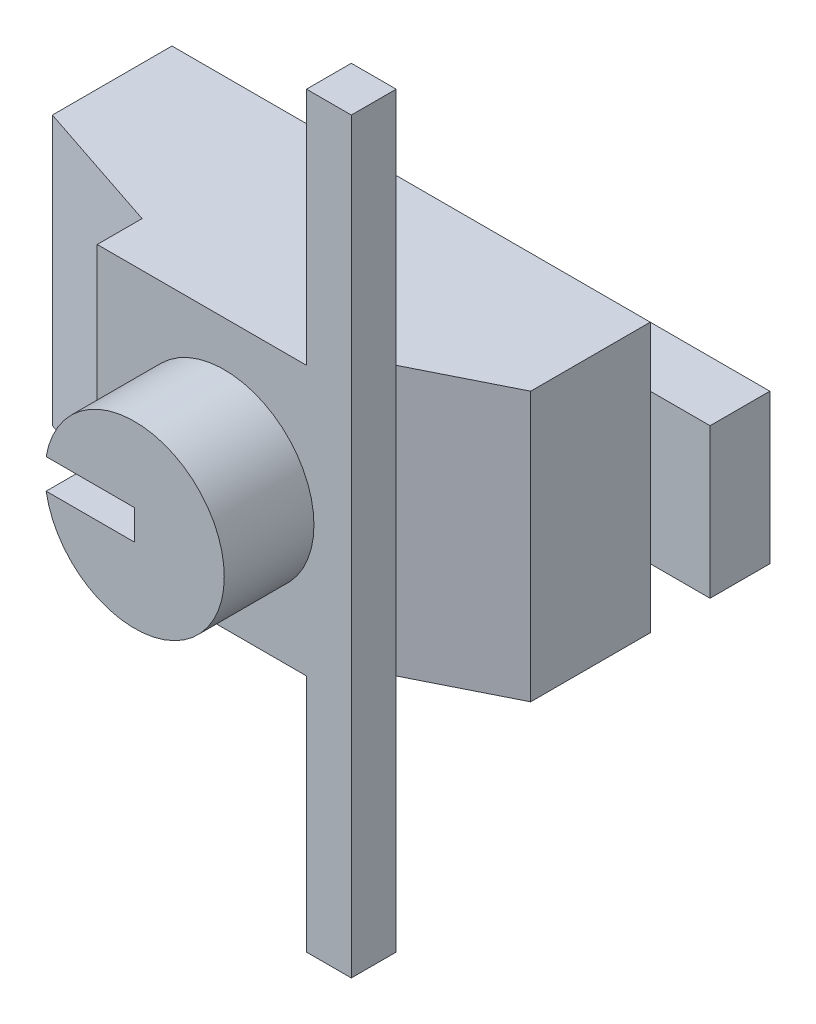
ISO-10303-21;
HEADER;
FILE_DESCRIPTION(('STEP AP214'),'2;1');
FILE_NAME('part.step','',(''),(''),'','','');
FILE_SCHEMA(('AUTOMOTIVE_DESIGN { 1 0 10303 214 1 1 1 1 }'));
ENDSEC;
DATA;
#1=APPLICATION_CONTEXT('core data for automotive mechanical design processes');
#2=APPLICATION_PROTOCOL_DEFINITION('international standard','automotive_design',2000,#1);
#3=PRODUCT_CONTEXT('',#1,'mechanical');
#4=PRODUCT('Part','Part','',(#3));
#5=PRODUCT_RELATED_PRODUCT_CATEGORY('part','',(#4));
#6=PRODUCT_DEFINITION_FORMATION('','',#4);
#7=PRODUCT_DEFINITION_CONTEXT('part definition',#1,'design');
#8=PRODUCT_DEFINITION('design','',#6,#7);
#9=PRODUCT_DEFINITION_SHAPE('','',#8);
#10=(LENGTH_UNIT() NAMED_UNIT(*) SI_UNIT(.MILLI.,.METRE.));
#11=(NAMED_UNIT(*) PLANE_ANGLE_UNIT() SI_UNIT($,.RADIAN.));
#12=(NAMED_UNIT(*) SI_UNIT($,.STERADIAN.) SOLID_ANGLE_UNIT());
#13=UNCERTAINTY_MEASURE_WITH_UNIT(LENGTH_MEASURE(1.E-05),#10,'distance_accuracy_value','');
#14=(GEOMETRIC_REPRESENTATION_CONTEXT(3) GLOBAL_UNCERTAINTY_ASSIGNED_CONTEXT((#13)) GLOBAL_UNIT_ASSIGNED_CONTEXT((#10,
#11,#12)) REPRESENTATION_CONTEXT('',''));
#15=CARTESIAN_POINT('',(0.,0.,0.));
#16=DIRECTION('',(0.,0.,1.));
#17=DIRECTION('',(1.,0.,0.));
#18=AXIS2_PLACEMENT_3D('',#15,#16,#17);
#19=CARTESIAN_POINT('',(107.5,-25.,120.));
#20=DIRECTION('',(0.,0.,-1.));
#21=DIRECTION('',(-1.,0.,0.));
#22=AXIS2_PLACEMENT_3D('',#19,#20,#21);
#23=CYLINDRICAL_SURFACE('',#22,30.);
#24=DIRECTION('',(0.,0.,1.));
#25=VECTOR('',#24,1.);
#26=CARTESIAN_POINT('',(77.9196010845019,-30.,90.));
#27=LINE('',#26,#25);
#28=CARTESIAN_POINT('',(77.9196010845019,-30.,90.));
#29=VERTEX_POINT('',#28);
#30=CARTESIAN_POINT('',(77.9196010845019,-30.,120.));
#31=VERTEX_POINT('',#30);
#32=EDGE_CURVE('E217',#29,#31,#27,.T.);
#33=ORIENTED_EDGE('',*,*,#32,.F.);
#34=CARTESIAN_POINT('',(107.5,-25.,90.));
#35=DIRECTION('',(0.,0.,1.));
#36=DIRECTION('',(1.,0.,0.));
#37=AXIS2_PLACEMENT_3D('',#34,#35,#36);
#38=CIRCLE('',#37,30.);
#39=CARTESIAN_POINT('',(77.9196010845019,-20.,90.));
#40=VERTEX_POINT('',#39);
#41=EDGE_CURVE('E11',#29,#40,#38,.T.);
#42=ORIENTED_EDGE('',*,*,#41,.T.);
#43=DIRECTION('',(0.,0.,1.));
#44=VECTOR('',#43,1.);
#45=CARTESIAN_POINT('',(77.9196010845019,-20.,90.));
#46=LINE('',#45,#44);
#47=CARTESIAN_POINT('',(77.9196010845019,-20.,120.));
#48=VERTEX_POINT('',#47);
#49=EDGE_CURVE('E220',#40,#48,#46,.T.);
#50=ORIENTED_EDGE('',*,*,#49,.T.);
#51=CARTESIAN_POINT('',(107.5,-25.,120.));
#52=DIRECTION('',(0.,0.,1.));
#53=DIRECTION('',(1.,0.,0.));
#54=AXIS2_PLACEMENT_3D('',#51,#52,#53);
#55=CIRCLE('',#54,30.);
#56=EDGE_CURVE('E219',#31,#48,#55,.T.);
#57=ORIENTED_EDGE('',*,*,#56,.F.);
#58=EDGE_LOOP('',(#33,#42,#50,#57));
#59=FACE_BOUND('',#58,.T.);
#60=ADVANCED_FACE('F33',(#59),#23,.T.);
#61=CARTESIAN_POINT('',(107.5,-25.,120.));
#62=DIRECTION('',(0.,0.,1.));
#63=DIRECTION('',(1.,0.,0.));
#64=AXIS2_PLACEMENT_3D('',#61,#62,#63);
#65=PLANE('',#64);
#66=DIRECTION('',(0.,-1.,0.));
#67=VECTOR('',#66,1.);
#68=CARTESIAN_POINT('',(107.5,0.,120.));
#69=LINE('',#68,#67);
#70=CARTESIAN_POINT('',(107.5,-20.,120.));
#71=VERTEX_POINT('',#70);
#72=CARTESIAN_POINT('',(107.5,-30.,120.));
#73=VERTEX_POINT('',#72);
#74=EDGE_CURVE('E211',#71,#73,#69,.T.);
#75=ORIENTED_EDGE('',*,*,#74,.T.);
#76=DIRECTION('',(-1.,0.,0.));
#77=VECTOR('',#76,1.);
#78=CARTESIAN_POINT('',(0.,-30.,120.));
#79=LINE('',#78,#77);
#80=EDGE_CURVE('E50',#73,#31,#79,.T.);
#81=ORIENTED_EDGE('',*,*,#80,.T.);
#82=ORIENTED_EDGE('',*,*,#56,.T.);
#83=DIRECTION('',(-1.,0.,0.));
#84=VECTOR('',#83,1.);
#85=CARTESIAN_POINT('',(0.,-20.,120.));
#86=LINE('',#85,#84);
#87=EDGE_CURVE('E209',#71,#48,#86,.T.);
#88=ORIENTED_EDGE('',*,*,#87,.F.);
#89=EDGE_LOOP('',(#75,#81,#82,#88));
#90=FACE_BOUND('',#89,.T.);
#91=ADVANCED_FACE('F424',(#90),#65,.T.);
#92=CARTESIAN_POINT('',(20.,-70.,60.));
#93=DIRECTION('',(0.,1.,0.));
#94=DIRECTION('',(0.,0.,1.));
#95=AXIS2_PLACEMENT_3D('',#92,#93,#94);
#96=PLANE('',#95);
#97=DIRECTION('',(1.,0.,0.));
#98=VECTOR('',#97,1.);
#99=CARTESIAN_POINT('',(20.,-70.,75.));
#100=LINE('',#99,#98);
#101=CARTESIAN_POINT('',(135.,-70.,75.));
#102=VERTEX_POINT('',#101);
#103=CARTESIAN_POINT('',(150.,-70.,75.));
#104=VERTEX_POINT('',#103);
#105=EDGE_CURVE('E262',#102,#104,#100,.T.);
#106=ORIENTED_EDGE('',*,*,#105,.F.);
#107=DIRECTION('',(0.,0.,-1.));
#108=VECTOR('',#107,1.);
#109=CARTESIAN_POINT('',(135.,-70.,60.));
#110=LINE('',#109,#108);
#111=CARTESIAN_POINT('',(135.,-70.,90.));
#112=VERTEX_POINT('',#111);
#113=EDGE_CURVE('E265',#112,#102,#110,.T.);
#114=ORIENTED_EDGE('',*,*,#113,.F.);
#115=DIRECTION('',(1.,0.,0.));
#116=VECTOR('',#115,1.);
#117=CARTESIAN_POINT('',(0.,-70.,90.));
#118=LINE('',#117,#116);
#119=CARTESIAN_POINT('',(65.,-70.,90.));
#120=VERTEX_POINT('',#119);
#121=EDGE_CURVE('E281',#120,#112,#118,.T.);
#122=ORIENTED_EDGE('',*,*,#121,.F.);
#123=DIRECTION('',(0.,0.,1.));
#124=VECTOR('',#123,1.);
#125=CARTESIAN_POINT('',(65.,-70.,0.));
#126=LINE('',#125,#124);
#127=CARTESIAN_POINT('',(65.,-70.,75.));
#128=VERTEX_POINT('',#127);
#129=EDGE_CURVE('E284',#128,#120,#126,.T.);
#130=ORIENTED_EDGE('',*,*,#129,.F.);
#131=DIRECTION('',(0.948683298050514,0.,0.316227766016838));
#132=VECTOR('',#131,1.);
#133=CARTESIAN_POINT('',(-16.,-70.,48.));
#134=LINE('',#133,#132);
#135=CARTESIAN_POINT('',(20.,-70.,60.));
#136=VERTEX_POINT('',#135);
#137=EDGE_CURVE('E272',#136,#128,#134,.T.);
#138=ORIENTED_EDGE('',*,*,#137,.F.);
#139=DIRECTION('',(0.,0.,-1.));
#140=VECTOR('',#139,1.);
#141=CARTESIAN_POINT('',(20.,-70.,60.));
#142=LINE('',#141,#140);
#143=CARTESIAN_POINT('',(20.,-70.,20.));
#144=VERTEX_POINT('',#143);
#145=EDGE_CURVE('E325',#136,#144,#142,.T.);
#146=ORIENTED_EDGE('',*,*,#145,.T.);
#147=DIRECTION('',(1.,0.,0.));
#148=VECTOR('',#147,1.);
#149=CARTESIAN_POINT('',(20.,-70.,20.));
#150=LINE('',#149,#148);
#151=CARTESIAN_POINT('',(180.,-70.,20.));
#152=VERTEX_POINT('',#151);
#153=EDGE_CURVE('E309',#144,#152,#150,.T.);
#154=ORIENTED_EDGE('',*,*,#153,.T.);
#155=DIRECTION('',(0.,0.,-1.));
#156=VECTOR('',#155,1.);
#157=CARTESIAN_POINT('',(180.,-70.,60.));
#158=LINE('',#157,#156);
#159=CARTESIAN_POINT('',(180.,-70.,60.));
#160=VERTEX_POINT('',#159);
#161=EDGE_CURVE('E322',#160,#152,#158,.T.);
#162=ORIENTED_EDGE('',*,*,#161,.F.);
#163=DIRECTION('',(0.894427190999916,0.,-0.447213595499958));
#164=VECTOR('',#163,1.);
#165=CARTESIAN_POINT('',(60.,-70.,120.));
#166=LINE('',#165,#164);
#167=EDGE_CURVE('E267',#104,#160,#166,.T.);
#168=ORIENTED_EDGE('',*,*,#167,.F.);
#169=EDGE_LOOP('',(#106,#114,#122,#130,#138,#146,#154,#162,#168));
#170=FACE_BOUND('',#169,.T.);
#171=ADVANCED_FACE('F430',(#170),#96,.F.);
#172=CARTESIAN_POINT('',(20.,20.,60.));
#173=DIRECTION('',(0.,-1.,0.));
#174=DIRECTION('',(0.,0.,-1.));
#175=AXIS2_PLACEMENT_3D('',#172,#173,#174);
#176=PLANE('',#175);
#177=DIRECTION('',(-1.,0.,0.));
#178=VECTOR('',#177,1.);
#179=CARTESIAN_POINT('',(20.,20.,75.));
#180=LINE('',#179,#178);
#181=CARTESIAN_POINT('',(150.,20.,75.));
#182=VERTEX_POINT('',#181);
#183=CARTESIAN_POINT('',(135.,20.,75.));
#184=VERTEX_POINT('',#183);
#185=EDGE_CURVE('E260',#182,#184,#180,.T.);
#186=ORIENTED_EDGE('',*,*,#185,.F.);
#187=DIRECTION('',(0.894427190999916,0.,-0.447213595499958));
#188=VECTOR('',#187,1.);
#189=CARTESIAN_POINT('',(60.,20.,120.));
#190=LINE('',#189,#188);
#191=CARTESIAN_POINT('',(180.,20.,60.));
#192=VERTEX_POINT('',#191);
#193=EDGE_CURVE('E268',#182,#192,#190,.T.);
#194=ORIENTED_EDGE('',*,*,#193,.T.);
#195=DIRECTION('',(0.,0.,-1.));
#196=VECTOR('',#195,1.);
#197=CARTESIAN_POINT('',(180.,20.,60.));
#198=LINE('',#197,#196);
#199=CARTESIAN_POINT('',(180.,20.,20.));
#200=VERTEX_POINT('',#199);
#201=EDGE_CURVE('E319',#192,#200,#198,.T.);
#202=ORIENTED_EDGE('',*,*,#201,.T.);
#203=DIRECTION('',(-1.,0.,0.));
#204=VECTOR('',#203,1.);
#205=CARTESIAN_POINT('',(20.,20.,20.));
#206=LINE('',#205,#204);
#207=CARTESIAN_POINT('',(20.,20.,20.));
#208=VERTEX_POINT('',#207);
#209=EDGE_CURVE('E302',#200,#208,#206,.T.);
#210=ORIENTED_EDGE('',*,*,#209,.T.);
#211=DIRECTION('',(0.,0.,-1.));
#212=VECTOR('',#211,1.);
#213=CARTESIAN_POINT('',(20.,20.,60.));
#214=LINE('',#213,#212);
#215=CARTESIAN_POINT('',(20.,20.,60.));
#216=VERTEX_POINT('',#215);
#217=EDGE_CURVE('E305',#216,#208,#214,.T.);
#218=ORIENTED_EDGE('',*,*,#217,.F.);
#219=DIRECTION('',(0.948683298050514,0.,0.316227766016838));
#220=VECTOR('',#219,1.);
#221=CARTESIAN_POINT('',(-16.,20.,48.));
#222=LINE('',#221,#220);
#223=CARTESIAN_POINT('',(65.,20.,75.));
#224=VERTEX_POINT('',#223);
#225=EDGE_CURVE('E276',#216,#224,#222,.T.);
#226=ORIENTED_EDGE('',*,*,#225,.T.);
#227=DIRECTION('',(0.,0.,1.));
#228=VECTOR('',#227,1.);
#229=CARTESIAN_POINT('',(65.,20.,0.));
#230=LINE('',#229,#228);
#231=CARTESIAN_POINT('',(65.,20.,90.));
#232=VERTEX_POINT('',#231);
#233=EDGE_CURVE('E274',#224,#232,#230,.T.);
#234=ORIENTED_EDGE('',*,*,#233,.T.);
#235=DIRECTION('',(1.,0.,0.));
#236=VECTOR('',#235,1.);
#237=CARTESIAN_POINT('',(0.,20.,90.));
#238=LINE('',#237,#236);
#239=CARTESIAN_POINT('',(135.,20.,90.));
#240=VERTEX_POINT('',#239);
#241=EDGE_CURVE('E271',#232,#240,#238,.T.);
#242=ORIENTED_EDGE('',*,*,#241,.T.);
#243=DIRECTION('',(0.,0.,1.));
#244=VECTOR('',#243,1.);
#245=CARTESIAN_POINT('',(135.,20.,60.));
#246=LINE('',#245,#244);
#247=EDGE_CURVE('E58',#184,#240,#246,.T.);
#248=ORIENTED_EDGE('',*,*,#247,.F.);
#249=EDGE_LOOP('',(#186,#194,#202,#210,#218,#226,#234,#242,#248));
#250=FACE_BOUND('',#249,.T.);
#251=ADVANCED_FACE('F374',(#250),#176,.F.);
#252=CARTESIAN_POINT('',(0.,0.,20.));
#253=DIRECTION('',(0.,0.,1.));
#254=DIRECTION('',(1.,0.,0.));
#255=AXIS2_PLACEMENT_3D('',#252,#253,#254);
#256=PLANE('',#255);
#257=DIRECTION('',(0.,-1.,0.));
#258=VECTOR('',#257,1.);
#259=CARTESIAN_POINT('',(20.,20.,20.));
#260=LINE('',#259,#258);
#261=CARTESIAN_POINT('',(20.,0.,20.));
#262=VERTEX_POINT('',#261);
#263=CARTESIAN_POINT('',(20.,-50.,20.));
#264=VERTEX_POINT('',#263);
#265=EDGE_CURVE('E42',#262,#264,#260,.T.);
#266=ORIENTED_EDGE('',*,*,#265,.F.);
#267=DIRECTION('',(-1.,0.,0.));
#268=VECTOR('',#267,1.);
#269=CARTESIAN_POINT('',(0.,0.,20.));
#270=LINE('',#269,#268);
#271=CARTESIAN_POINT('',(0.,0.,20.));
#272=VERTEX_POINT('',#271);
#273=EDGE_CURVE('E340',#262,#272,#270,.T.);
#274=ORIENTED_EDGE('',*,*,#273,.T.);
#275=DIRECTION('',(0.,-1.,0.));
#276=VECTOR('',#275,1.);
#277=CARTESIAN_POINT('',(0.,0.,20.));
#278=LINE('',#277,#276);
#279=CARTESIAN_POINT('',(0.,-50.,20.));
#280=VERTEX_POINT('',#279);
#281=EDGE_CURVE('E329',#272,#280,#278,.T.);
#282=ORIENTED_EDGE('',*,*,#281,.T.);
#283=DIRECTION('',(1.,0.,0.));
#284=VECTOR('',#283,1.);
#285=CARTESIAN_POINT('',(0.,-50.,20.));
#286=LINE('',#285,#284);
#287=EDGE_CURVE('E334',#280,#264,#286,.T.);
#288=ORIENTED_EDGE('',*,*,#287,.T.);
#289=EDGE_LOOP('',(#266,#274,#282,#288));
#290=FACE_BOUND('',#289,.T.);
#291=ADVANCED_FACE('F472',(#290),#256,.T.);
#292=CARTESIAN_POINT('',(0.,0.,20.));
#293=DIRECTION('',(1.,0.,0.));
#294=DIRECTION('',(0.,1.,0.));
#295=AXIS2_PLACEMENT_3D('',#292,#293,#294);
#296=PLANE('',#295);
#297=DIRECTION('',(0.,-1.,0.));
#298=VECTOR('',#297,1.);
#299=CARTESIAN_POINT('',(0.,0.,0.));
#300=LINE('',#299,#298);
#301=CARTESIAN_POINT('',(0.,0.,0.));
#302=VERTEX_POINT('',#301);
#303=CARTESIAN_POINT('',(0.,-50.,0.));
#304=VERTEX_POINT('',#303);
#305=EDGE_CURVE('E328',#302,#304,#300,.T.);
#306=ORIENTED_EDGE('',*,*,#305,.T.);
#307=DIRECTION('',(0.,0.,-1.));
#308=VECTOR('',#307,1.);
#309=CARTESIAN_POINT('',(0.,-50.,20.));
#310=LINE('',#309,#308);
#311=EDGE_CURVE('E37',#280,#304,#310,.T.);
#312=ORIENTED_EDGE('',*,*,#311,.F.);
#313=ORIENTED_EDGE('',*,*,#281,.F.);
#314=DIRECTION('',(0.,0.,-1.));
#315=VECTOR('',#314,1.);
#316=CARTESIAN_POINT('',(0.,0.,20.));
#317=LINE('',#316,#315);
#318=EDGE_CURVE('E343',#272,#302,#317,.T.);
#319=ORIENTED_EDGE('',*,*,#318,.T.);
#320=EDGE_LOOP('',(#306,#312,#313,#319));
#321=FACE_BOUND('',#320,.T.);
#322=ADVANCED_FACE('F35',(#321),#296,.F.);
#323=CARTESIAN_POINT('',(0.,-50.,20.));
#324=DIRECTION('',(0.,1.,0.));
#325=DIRECTION('',(0.,0.,1.));
#326=AXIS2_PLACEMENT_3D('',#323,#324,#325);
#327=PLANE('',#326);
#328=DIRECTION('',(1.,0.,0.));
#329=VECTOR('',#328,1.);
#330=CARTESIAN_POINT('',(0.,-50.,0.));
#331=LINE('',#330,#329);
#332=CARTESIAN_POINT('',(200.,-50.,0.));
#333=VERTEX_POINT('',#332);
#334=EDGE_CURVE('E347',#304,#333,#331,.T.);
#335=ORIENTED_EDGE('',*,*,#334,.T.);
#336=DIRECTION('',(0.,0.,-1.));
#337=VECTOR('',#336,1.);
#338=CARTESIAN_POINT('',(200.,-50.,20.));
#339=LINE('',#338,#337);
#340=CARTESIAN_POINT('',(200.,-50.,20.));
#341=VERTEX_POINT('',#340);
#342=EDGE_CURVE('E356',#341,#333,#339,.T.);
#343=ORIENTED_EDGE('',*,*,#342,.F.);
#344=CARTESIAN_POINT('',(180.,-50.,20.));
#345=VERTEX_POINT('',#344);
#346=EDGE_CURVE('E332',#345,#341,#286,.T.);
#347=ORIENTED_EDGE('',*,*,#346,.F.);
#348=EDGE_CURVE('E338',#264,#345,#286,.T.);
#349=ORIENTED_EDGE('',*,*,#348,.F.);
#350=ORIENTED_EDGE('',*,*,#287,.F.);
#351=ORIENTED_EDGE('',*,*,#311,.T.);
#352=EDGE_LOOP('',(#335,#343,#347,#349,#350,#351));
#353=FACE_BOUND('',#352,.T.);
#354=ADVANCED_FACE('F463',(#353),#327,.F.);
#355=CARTESIAN_POINT('',(200.,0.,20.));
#356=DIRECTION('',(-1.,0.,0.));
#357=DIRECTION('',(0.,0.,1.));
#358=AXIS2_PLACEMENT_3D('',#355,#356,#357);
#359=PLANE('',#358);
#360=DIRECTION('',(0.,1.,0.));
#361=VECTOR('',#360,1.);
#362=CARTESIAN_POINT('',(200.,0.,0.));
#363=LINE('',#362,#361);
#364=CARTESIAN_POINT('',(200.,0.,0.));
#365=VERTEX_POINT('',#364);
#366=EDGE_CURVE('E349',#333,#365,#363,.T.);
#367=ORIENTED_EDGE('',*,*,#366,.T.);
#368=DIRECTION('',(0.,0.,-1.));
#369=VECTOR('',#368,1.);
#370=CARTESIAN_POINT('',(200.,0.,20.));
#371=LINE('',#370,#369);
#372=CARTESIAN_POINT('',(200.,0.,20.));
#373=VERTEX_POINT('',#372);
#374=EDGE_CURVE('E354',#373,#365,#371,.T.);
#375=ORIENTED_EDGE('',*,*,#374,.F.);
#376=DIRECTION('',(0.,1.,0.));
#377=VECTOR('',#376,1.);
#378=CARTESIAN_POINT('',(200.,0.,20.));
#379=LINE('',#378,#377);
#380=EDGE_CURVE('E337',#341,#373,#379,.T.);
#381=ORIENTED_EDGE('',*,*,#380,.F.);
#382=ORIENTED_EDGE('',*,*,#342,.T.);
#383=EDGE_LOOP('',(#367,#375,#381,#382));
#384=FACE_BOUND('',#383,.T.);
#385=ADVANCED_FACE('F464',(#384),#359,.F.);
#386=CARTESIAN_POINT('',(0.,0.,20.));
#387=DIRECTION('',(0.,-1.,0.));
#388=DIRECTION('',(0.,0.,-1.));
#389=AXIS2_PLACEMENT_3D('',#386,#387,#388);
#390=PLANE('',#389);
#391=DIRECTION('',(-1.,0.,0.));
#392=VECTOR('',#391,1.);
#393=CARTESIAN_POINT('',(0.,0.,0.));
#394=LINE('',#393,#392);
#395=EDGE_CURVE('E333',#365,#302,#394,.T.);
#396=ORIENTED_EDGE('',*,*,#395,.T.);
#397=ORIENTED_EDGE('',*,*,#318,.F.);
#398=ORIENTED_EDGE('',*,*,#273,.F.);
#399=CARTESIAN_POINT('',(180.,0.,20.));
#400=VERTEX_POINT('',#399);
#401=EDGE_CURVE('E344',#400,#262,#270,.T.);
#402=ORIENTED_EDGE('',*,*,#401,.F.);
#403=EDGE_CURVE('E341',#373,#400,#270,.T.);
#404=ORIENTED_EDGE('',*,*,#403,.F.);
#405=ORIENTED_EDGE('',*,*,#374,.T.);
#406=EDGE_LOOP('',(#396,#397,#398,#402,#404,#405));
#407=FACE_BOUND('',#406,.T.);
#408=ADVANCED_FACE('F468',(#407),#390,.F.);
#409=DIRECTION('',(0.,1.,0.));
#410=VECTOR('',#409,1.);
#411=CARTESIAN_POINT('',(180.,20.,20.));
#412=LINE('',#411,#410);
#413=EDGE_CURVE('E315',#345,#400,#412,.T.);
#414=ORIENTED_EDGE('',*,*,#413,.F.);
#415=ORIENTED_EDGE('',*,*,#346,.T.);
#416=ORIENTED_EDGE('',*,*,#380,.T.);
#417=ORIENTED_EDGE('',*,*,#403,.T.);
#418=EDGE_LOOP('',(#414,#415,#416,#417));
#419=FACE_BOUND('',#418,.T.);
#420=ADVANCED_FACE('F461',(#419),#256,.T.);
#421=CARTESIAN_POINT('',(0.,0.,0.));
#422=DIRECTION('',(0.,0.,1.));
#423=DIRECTION('',(1.,0.,0.));
#424=AXIS2_PLACEMENT_3D('',#421,#422,#423);
#425=PLANE('',#424);
#426=ORIENTED_EDGE('',*,*,#305,.F.);
#427=ORIENTED_EDGE('',*,*,#395,.F.);
#428=ORIENTED_EDGE('',*,*,#366,.F.);
#429=ORIENTED_EDGE('',*,*,#334,.F.);
#430=EDGE_LOOP('',(#426,#427,#428,#429));
#431=FACE_BOUND('',#430,.T.);
#432=ADVANCED_FACE('F477',(#431),#425,.F.);
#433=CARTESIAN_POINT('',(0.,0.,20.));
#434=DIRECTION('',(0.,0.,1.));
#435=DIRECTION('',(1.,0.,0.));
#436=AXIS2_PLACEMENT_3D('',#433,#434,#435);
#437=PLANE('',#436);
#438=EDGE_CURVE('E290',#264,#144,#260,.T.);
#439=ORIENTED_EDGE('',*,*,#438,.F.);
#440=ORIENTED_EDGE('',*,*,#348,.T.);
#441=EDGE_CURVE('E312',#152,#345,#412,.T.);
#442=ORIENTED_EDGE('',*,*,#441,.F.);
#443=ORIENTED_EDGE('',*,*,#153,.F.);
#444=EDGE_LOOP('',(#439,#440,#442,#443));
#445=FACE_BOUND('',#444,.T.);
#446=ADVANCED_FACE('F458',(#445),#437,.F.);
#447=EDGE_CURVE('E311',#400,#200,#412,.T.);
#448=ORIENTED_EDGE('',*,*,#447,.F.);
#449=ORIENTED_EDGE('',*,*,#401,.T.);
#450=EDGE_CURVE('E306',#208,#262,#260,.T.);
#451=ORIENTED_EDGE('',*,*,#450,.F.);
#452=ORIENTED_EDGE('',*,*,#209,.F.);
#453=EDGE_LOOP('',(#448,#449,#451,#452));
#454=FACE_BOUND('',#453,.T.);
#455=ADVANCED_FACE('F378',(#454),#437,.F.);
#456=CARTESIAN_POINT('',(20.,20.,60.));
#457=DIRECTION('',(1.,0.,0.));
#458=DIRECTION('',(0.,1.,0.));
#459=AXIS2_PLACEMENT_3D('',#456,#457,#458);
#460=PLANE('',#459);
#461=ORIENTED_EDGE('',*,*,#450,.T.);
#462=ORIENTED_EDGE('',*,*,#265,.T.);
#463=ORIENTED_EDGE('',*,*,#438,.T.);
#464=ORIENTED_EDGE('',*,*,#145,.F.);
#465=DIRECTION('',(0.,-1.,0.));
#466=VECTOR('',#465,1.);
#467=CARTESIAN_POINT('',(20.,20.,60.));
#468=LINE('',#467,#466);
#469=EDGE_CURVE('E298',#216,#136,#468,.T.);
#470=ORIENTED_EDGE('',*,*,#469,.F.);
#471=ORIENTED_EDGE('',*,*,#217,.T.);
#472=EDGE_LOOP('',(#461,#462,#463,#464,#470,#471));
#473=FACE_BOUND('',#472,.T.);
#474=ADVANCED_FACE('F381',(#473),#460,.F.);
#475=CARTESIAN_POINT('',(180.,20.,60.));
#476=DIRECTION('',(-1.,0.,0.));
#477=DIRECTION('',(0.,0.,1.));
#478=AXIS2_PLACEMENT_3D('',#475,#476,#477);
#479=PLANE('',#478);
#480=ORIENTED_EDGE('',*,*,#441,.T.);
#481=ORIENTED_EDGE('',*,*,#413,.T.);
#482=ORIENTED_EDGE('',*,*,#447,.T.);
#483=ORIENTED_EDGE('',*,*,#201,.F.);
#484=DIRECTION('',(0.,1.,0.));
#485=VECTOR('',#484,1.);
#486=CARTESIAN_POINT('',(180.,20.,60.));
#487=LINE('',#486,#485);
#488=EDGE_CURVE('E301',#160,#192,#487,.T.);
#489=ORIENTED_EDGE('',*,*,#488,.F.);
#490=ORIENTED_EDGE('',*,*,#161,.T.);
#491=EDGE_LOOP('',(#480,#481,#482,#483,#489,#490));
#492=FACE_BOUND('',#491,.T.);
#493=ADVANCED_FACE('F369',(#492),#479,.F.);
#494=CARTESIAN_POINT('',(60.,20.,120.));
#495=DIRECTION('',(-0.447213595499958,0.,-0.894427190999916));
#496=DIRECTION('',(-0.894427190999916,0.,0.447213595499958));
#497=AXIS2_PLACEMENT_3D('',#494,#495,#496);
#498=PLANE('',#497);
#499=ORIENTED_EDGE('',*,*,#167,.T.);
#500=ORIENTED_EDGE('',*,*,#488,.T.);
#501=ORIENTED_EDGE('',*,*,#193,.F.);
#502=DIRECTION('',(0.,-1.,0.));
#503=VECTOR('',#502,1.);
#504=CARTESIAN_POINT('',(150.,20.,75.));
#505=LINE('',#504,#503);
#506=EDGE_CURVE('E278',#182,#104,#505,.T.);
#507=ORIENTED_EDGE('',*,*,#506,.T.);
#508=EDGE_LOOP('',(#499,#500,#501,#507));
#509=FACE_BOUND('',#508,.T.);
#510=ADVANCED_FACE('F449',(#509),#498,.F.);
#511=CARTESIAN_POINT('',(-16.,20.,48.));
#512=DIRECTION('',(0.316227766016838,0.,-0.948683298050514));
#513=DIRECTION('',(-0.948683298050514,0.,-0.316227766016838));
#514=AXIS2_PLACEMENT_3D('',#511,#512,#513);
#515=PLANE('',#514);
#516=ORIENTED_EDGE('',*,*,#137,.T.);
#517=DIRECTION('',(0.,-1.,0.));
#518=VECTOR('',#517,1.);
#519=CARTESIAN_POINT('',(65.,20.,75.));
#520=LINE('',#519,#518);
#521=EDGE_CURVE('E287',#224,#128,#520,.T.);
#522=ORIENTED_EDGE('',*,*,#521,.F.);
#523=ORIENTED_EDGE('',*,*,#225,.F.);
#524=ORIENTED_EDGE('',*,*,#469,.T.);
#525=EDGE_LOOP('',(#516,#522,#523,#524));
#526=FACE_BOUND('',#525,.T.);
#527=ADVANCED_FACE('F385',(#526),#515,.F.);
#528=CARTESIAN_POINT('',(65.,20.,0.));
#529=DIRECTION('',(1.,0.,0.));
#530=DIRECTION('',(0.,0.,-1.));
#531=AXIS2_PLACEMENT_3D('',#528,#529,#530);
#532=PLANE('',#531);
#533=ORIENTED_EDGE('',*,*,#129,.T.);
#534=DIRECTION('',(0.,-1.,0.));
#535=VECTOR('',#534,1.);
#536=CARTESIAN_POINT('',(65.,20.,90.));
#537=LINE('',#536,#535);
#538=EDGE_CURVE('E291',#232,#120,#537,.T.);
#539=ORIENTED_EDGE('',*,*,#538,.F.);
#540=ORIENTED_EDGE('',*,*,#233,.F.);
#541=ORIENTED_EDGE('',*,*,#521,.T.);
#542=EDGE_LOOP('',(#533,#539,#540,#541));
#543=FACE_BOUND('',#542,.T.);
#544=ADVANCED_FACE('F391',(#543),#532,.F.);
#545=CARTESIAN_POINT('',(0.,20.,90.));
#546=DIRECTION('',(0.,0.,-1.));
#547=DIRECTION('',(-1.,0.,0.));
#548=AXIS2_PLACEMENT_3D('',#545,#546,#547);
#549=PLANE('',#548);
#550=ORIENTED_EDGE('',*,*,#41,.F.);
#551=DIRECTION('',(-1.,0.,0.));
#552=VECTOR('',#551,1.);
#553=CARTESIAN_POINT('',(0.,-30.,90.));
#554=LINE('',#553,#552);
#555=CARTESIAN_POINT('',(107.5,-30.,90.));
#556=VERTEX_POINT('',#555);
#557=EDGE_CURVE('E201',#556,#29,#554,.T.);
#558=ORIENTED_EDGE('',*,*,#557,.F.);
#559=DIRECTION('',(0.,-1.,0.));
#560=VECTOR('',#559,1.);
#561=CARTESIAN_POINT('',(107.5,0.,90.));
#562=LINE('',#561,#560);
#563=CARTESIAN_POINT('',(107.5,-20.,90.));
#564=VERTEX_POINT('',#563);
#565=EDGE_CURVE('E190',#564,#556,#562,.T.);
#566=ORIENTED_EDGE('',*,*,#565,.F.);
#567=DIRECTION('',(-1.,0.,0.));
#568=VECTOR('',#567,1.);
#569=CARTESIAN_POINT('',(0.,-20.,90.));
#570=LINE('',#569,#568);
#571=EDGE_CURVE('E200',#564,#40,#570,.T.);
#572=ORIENTED_EDGE('',*,*,#571,.T.);
#573=EDGE_LOOP('',(#550,#558,#566,#572));
#574=FACE_BOUND('',#573,.T.);
#575=DIRECTION('',(0.,-1.,0.));
#576=VECTOR('',#575,1.);
#577=CARTESIAN_POINT('',(150.,20.,90.));
#578=LINE('',#577,#576);
#579=CARTESIAN_POINT('',(150.,100.,90.));
#580=VERTEX_POINT('',#579);
#581=CARTESIAN_POINT('',(150.,-150.,90.));
#582=VERTEX_POINT('',#581);
#583=EDGE_CURVE('E294',#580,#582,#578,.T.);
#584=ORIENTED_EDGE('',*,*,#583,.F.);
#585=DIRECTION('',(1.,0.,0.));
#586=VECTOR('',#585,1.);
#587=CARTESIAN_POINT('',(150.,100.,90.));
#588=LINE('',#587,#586);
#589=CARTESIAN_POINT('',(135.,100.,90.));
#590=VERTEX_POINT('',#589);
#591=EDGE_CURVE('E235',#590,#580,#588,.T.);
#592=ORIENTED_EDGE('',*,*,#591,.F.);
#593=DIRECTION('',(0.,-1.,0.));
#594=VECTOR('',#593,1.);
#595=CARTESIAN_POINT('',(135.,100.,90.));
#596=LINE('',#595,#594);
#597=EDGE_CURVE('E249',#590,#240,#596,.T.);
#598=ORIENTED_EDGE('',*,*,#597,.T.);
#599=ORIENTED_EDGE('',*,*,#241,.F.);
#600=ORIENTED_EDGE('',*,*,#538,.T.);
#601=ORIENTED_EDGE('',*,*,#121,.T.);
#602=CARTESIAN_POINT('',(135.,-150.,90.));
#603=VERTEX_POINT('',#602);
#604=EDGE_CURVE('E238',#112,#603,#596,.T.);
#605=ORIENTED_EDGE('',*,*,#604,.T.);
#606=DIRECTION('',(1.,0.,0.));
#607=VECTOR('',#606,1.);
#608=CARTESIAN_POINT('',(150.,-150.,90.));
#609=LINE('',#608,#607);
#610=EDGE_CURVE('E231',#603,#582,#609,.T.);
#611=ORIENTED_EDGE('',*,*,#610,.T.);
#612=EDGE_LOOP('',(#584,#592,#598,#599,#600,#601,#605,#611));
#613=FACE_BOUND('',#612,.T.);
#614=ADVANCED_FACE('F207',(#574,#613),#549,.F.);
#615=CARTESIAN_POINT('',(150.,20.,0.));
#616=DIRECTION('',(-1.,0.,0.));
#617=DIRECTION('',(0.,0.,1.));
#618=AXIS2_PLACEMENT_3D('',#615,#616,#617);
#619=PLANE('',#618);
#620=ORIENTED_EDGE('',*,*,#583,.T.);
#621=DIRECTION('',(0.,0.,-1.));
#622=VECTOR('',#621,1.);
#623=CARTESIAN_POINT('',(150.,-150.,90.));
#624=LINE('',#623,#622);
#625=CARTESIAN_POINT('',(150.,-150.,75.));
#626=VERTEX_POINT('',#625);
#627=EDGE_CURVE('E225',#582,#626,#624,.T.);
#628=ORIENTED_EDGE('',*,*,#627,.T.);
#629=DIRECTION('',(0.,-1.,0.));
#630=VECTOR('',#629,1.);
#631=CARTESIAN_POINT('',(150.,100.,75.));
#632=LINE('',#631,#630);
#633=EDGE_CURVE('E256',#104,#626,#632,.T.);
#634=ORIENTED_EDGE('',*,*,#633,.F.);
#635=ORIENTED_EDGE('',*,*,#506,.F.);
#636=CARTESIAN_POINT('',(150.,100.,75.));
#637=VERTEX_POINT('',#636);
#638=EDGE_CURVE('E257',#637,#182,#632,.T.);
#639=ORIENTED_EDGE('',*,*,#638,.F.);
#640=DIRECTION('',(0.,0.,-1.));
#641=VECTOR('',#640,1.);
#642=CARTESIAN_POINT('',(150.,100.,90.));
#643=LINE('',#642,#641);
#644=EDGE_CURVE('E227',#580,#637,#643,.T.);
#645=ORIENTED_EDGE('',*,*,#644,.F.);
#646=EDGE_LOOP('',(#620,#628,#634,#635,#639,#645));
#647=FACE_BOUND('',#646,.T.);
#648=ADVANCED_FACE('F404',(#647),#619,.F.);
#649=CARTESIAN_POINT('',(0.,100.,0.));
#650=DIRECTION('',(0.,1.,0.));
#651=DIRECTION('',(0.,0.,1.));
#652=AXIS2_PLACEMENT_3D('',#649,#650,#651);
#653=PLANE('',#652);
#654=ORIENTED_EDGE('',*,*,#644,.T.);
#655=DIRECTION('',(-1.,0.,0.));
#656=VECTOR('',#655,1.);
#657=CARTESIAN_POINT('',(150.,100.,75.));
#658=LINE('',#657,#656);
#659=CARTESIAN_POINT('',(135.,100.,75.));
#660=VERTEX_POINT('',#659);
#661=EDGE_CURVE('E230',#637,#660,#658,.T.);
#662=ORIENTED_EDGE('',*,*,#661,.T.);
#663=DIRECTION('',(0.,0.,1.));
#664=VECTOR('',#663,1.);
#665=CARTESIAN_POINT('',(135.,100.,90.));
#666=LINE('',#665,#664);
#667=EDGE_CURVE('E233',#660,#590,#666,.T.);
#668=ORIENTED_EDGE('',*,*,#667,.T.);
#669=ORIENTED_EDGE('',*,*,#591,.T.);
#670=EDGE_LOOP('',(#654,#662,#668,#669));
#671=FACE_BOUND('',#670,.T.);
#672=ADVANCED_FACE('F401',(#671),#653,.T.);
#673=CARTESIAN_POINT('',(135.,100.,90.));
#674=DIRECTION('',(1.,0.,0.));
#675=DIRECTION('',(0.,0.,-1.));
#676=AXIS2_PLACEMENT_3D('',#673,#674,#675);
#677=PLANE('',#676);
#678=DIRECTION('',(0.,-1.,0.));
#679=VECTOR('',#678,1.);
#680=CARTESIAN_POINT('',(135.,100.,75.));
#681=LINE('',#680,#679);
#682=EDGE_CURVE('E253',#660,#184,#681,.T.);
#683=ORIENTED_EDGE('',*,*,#682,.T.);
#684=ORIENTED_EDGE('',*,*,#247,.T.);
#685=ORIENTED_EDGE('',*,*,#597,.F.);
#686=ORIENTED_EDGE('',*,*,#667,.F.);
#687=EDGE_LOOP('',(#683,#684,#685,#686));
#688=FACE_BOUND('',#687,.T.);
#689=ADVANCED_FACE('F395',(#688),#677,.F.);
#690=CARTESIAN_POINT('',(150.,100.,75.));
#691=DIRECTION('',(0.,0.,1.));
#692=DIRECTION('',(1.,0.,0.));
#693=AXIS2_PLACEMENT_3D('',#690,#691,#692);
#694=PLANE('',#693);
#695=ORIENTED_EDGE('',*,*,#638,.T.);
#696=ORIENTED_EDGE('',*,*,#185,.T.);
#697=ORIENTED_EDGE('',*,*,#682,.F.);
#698=ORIENTED_EDGE('',*,*,#661,.F.);
#699=EDGE_LOOP('',(#695,#696,#697,#698));
#700=FACE_BOUND('',#699,.T.);
#701=ADVANCED_FACE('F408',(#700),#694,.F.);
#702=ORIENTED_EDGE('',*,*,#604,.F.);
#703=ORIENTED_EDGE('',*,*,#113,.T.);
#704=CARTESIAN_POINT('',(135.,-150.,75.));
#705=VERTEX_POINT('',#704);
#706=EDGE_CURVE('E252',#102,#705,#681,.T.);
#707=ORIENTED_EDGE('',*,*,#706,.T.);
#708=DIRECTION('',(0.,0.,1.));
#709=VECTOR('',#708,1.);
#710=CARTESIAN_POINT('',(135.,-150.,90.));
#711=LINE('',#710,#709);
#712=EDGE_CURVE('E244',#705,#603,#711,.T.);
#713=ORIENTED_EDGE('',*,*,#712,.T.);
#714=EDGE_LOOP('',(#702,#703,#707,#713));
#715=FACE_BOUND('',#714,.T.);
#716=ADVANCED_FACE('F410',(#715),#677,.F.);
#717=ORIENTED_EDGE('',*,*,#706,.F.);
#718=ORIENTED_EDGE('',*,*,#105,.T.);
#719=ORIENTED_EDGE('',*,*,#633,.T.);
#720=DIRECTION('',(-1.,0.,0.));
#721=VECTOR('',#720,1.);
#722=CARTESIAN_POINT('',(150.,-150.,75.));
#723=LINE('',#722,#721);
#724=EDGE_CURVE('E241',#626,#705,#723,.T.);
#725=ORIENTED_EDGE('',*,*,#724,.T.);
#726=EDGE_LOOP('',(#717,#718,#719,#725));
#727=FACE_BOUND('',#726,.T.);
#728=ADVANCED_FACE('F412',(#727),#694,.F.);
#729=CARTESIAN_POINT('',(0.,-150.,0.));
#730=DIRECTION('',(0.,1.,0.));
#731=DIRECTION('',(0.,0.,1.));
#732=AXIS2_PLACEMENT_3D('',#729,#730,#731);
#733=PLANE('',#732);
#734=ORIENTED_EDGE('',*,*,#627,.F.);
#735=ORIENTED_EDGE('',*,*,#610,.F.);
#736=ORIENTED_EDGE('',*,*,#712,.F.);
#737=ORIENTED_EDGE('',*,*,#724,.F.);
#738=EDGE_LOOP('',(#734,#735,#736,#737));
#739=FACE_BOUND('',#738,.T.);
#740=ADVANCED_FACE('F421',(#739),#733,.F.);
#741=CARTESIAN_POINT('',(0.,-30.,90.));
#742=DIRECTION('',(0.,1.,0.));
#743=DIRECTION('',(-1.,0.,0.));
#744=AXIS2_PLACEMENT_3D('',#741,#742,#743);
#745=PLANE('',#744);
#746=ORIENTED_EDGE('',*,*,#80,.F.);
#747=DIRECTION('',(0.,0.,1.));
#748=VECTOR('',#747,1.);
#749=CARTESIAN_POINT('',(107.5,-30.,90.));
#750=LINE('',#749,#748);
#751=EDGE_CURVE('E193',#556,#73,#750,.T.);
#752=ORIENTED_EDGE('',*,*,#751,.F.);
#753=ORIENTED_EDGE('',*,*,#557,.T.);
#754=ORIENTED_EDGE('',*,*,#32,.T.);
#755=EDGE_LOOP('',(#746,#752,#753,#754));
#756=FACE_BOUND('',#755,.T.);
#757=ADVANCED_FACE('F203',(#756),#745,.T.);
#758=CARTESIAN_POINT('',(0.,-20.,90.));
#759=DIRECTION('',(0.,1.,0.));
#760=DIRECTION('',(-1.,0.,0.));
#761=AXIS2_PLACEMENT_3D('',#758,#759,#760);
#762=PLANE('',#761);
#763=ORIENTED_EDGE('',*,*,#87,.T.);
#764=ORIENTED_EDGE('',*,*,#49,.F.);
#765=ORIENTED_EDGE('',*,*,#571,.F.);
#766=DIRECTION('',(0.,0.,1.));
#767=VECTOR('',#766,1.);
#768=CARTESIAN_POINT('',(107.5,-20.,90.));
#769=LINE('',#768,#767);
#770=EDGE_CURVE('E195',#564,#71,#769,.T.);
#771=ORIENTED_EDGE('',*,*,#770,.T.);
#772=EDGE_LOOP('',(#763,#764,#765,#771));
#773=FACE_BOUND('',#772,.T.);
#774=ADVANCED_FACE('F442',(#773),#762,.F.);
#775=CARTESIAN_POINT('',(107.5,0.,90.));
#776=DIRECTION('',(-1.,0.,0.));
#777=DIRECTION('',(0.,0.,1.));
#778=AXIS2_PLACEMENT_3D('',#775,#776,#777);
#779=PLANE('',#778);
#780=ORIENTED_EDGE('',*,*,#74,.F.);
#781=ORIENTED_EDGE('',*,*,#770,.F.);
#782=ORIENTED_EDGE('',*,*,#565,.T.);
#783=ORIENTED_EDGE('',*,*,#751,.T.);
#784=EDGE_LOOP('',(#780,#781,#782,#783));
#785=FACE_BOUND('',#784,.T.);
#786=ADVANCED_FACE('F192',(#785),#779,.T.);
#787=CLOSED_SHELL('',(#60,#91,#171,#251,#291,#322,#354,#385,#408,#420,#432,#446,#455,#474,#493,
#510,#527,#544,#614,#648,#672,#689,#701,#716,#728,#740,#757,#774,#786));
#788=MANIFOLD_SOLID_BREP('B2',#787);
#789=ADVANCED_BREP_SHAPE_REPRESENTATION('',(#18,#788),#14);
#790=SHAPE_DEFINITION_REPRESENTATION(#9,#789);
ENDSEC;
END-ISO-10303-21;
